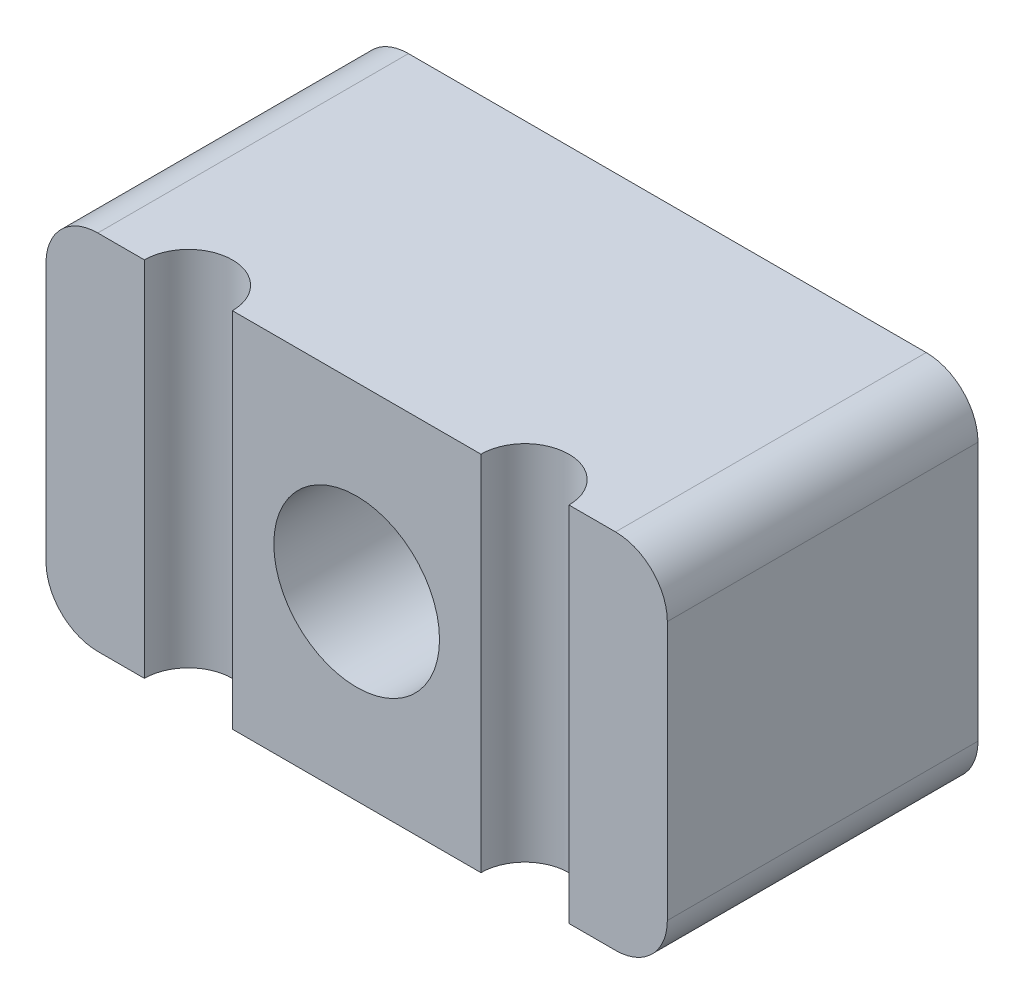
ISO-10303-21;
HEADER;
FILE_DESCRIPTION(('STEP AP214'),'2;1');
FILE_NAME('part.step','',(''),(''),'','','');
FILE_SCHEMA(('AUTOMOTIVE_DESIGN { 1 0 10303 214 1 1 1 1 }'));
ENDSEC;
DATA;
#1=APPLICATION_CONTEXT('core data for automotive mechanical design processes');
#2=APPLICATION_PROTOCOL_DEFINITION('international standard','automotive_design',2000,#1);
#3=PRODUCT_CONTEXT('',#1,'mechanical');
#4=PRODUCT('Part','Part','',(#3));
#5=PRODUCT_RELATED_PRODUCT_CATEGORY('part','',(#4));
#6=PRODUCT_DEFINITION_FORMATION('','',#4);
#7=PRODUCT_DEFINITION_CONTEXT('part definition',#1,'design');
#8=PRODUCT_DEFINITION('design','',#6,#7);
#9=PRODUCT_DEFINITION_SHAPE('','',#8);
#10=(LENGTH_UNIT() NAMED_UNIT(*) SI_UNIT(.MILLI.,.METRE.));
#11=(NAMED_UNIT(*) PLANE_ANGLE_UNIT() SI_UNIT($,.RADIAN.));
#12=(NAMED_UNIT(*) SI_UNIT($,.STERADIAN.) SOLID_ANGLE_UNIT());
#13=UNCERTAINTY_MEASURE_WITH_UNIT(LENGTH_MEASURE(1.E-05),#10,'distance_accuracy_value','');
#14=(GEOMETRIC_REPRESENTATION_CONTEXT(3) GLOBAL_UNCERTAINTY_ASSIGNED_CONTEXT((#13)) GLOBAL_UNIT_ASSIGNED_CONTEXT((#10,
#11,#12)) REPRESENTATION_CONTEXT('',''));
#15=CARTESIAN_POINT('',(0.,0.,0.));
#16=DIRECTION('',(0.,0.,1.));
#17=DIRECTION('',(1.,0.,0.));
#18=AXIS2_PLACEMENT_3D('',#15,#16,#17);
#19=CARTESIAN_POINT('',(1.,0.999999999999998,6.));
#20=DIRECTION('',(0.,0.,1.));
#21=DIRECTION('',(1.,0.,0.));
#22=AXIS2_PLACEMENT_3D('',#19,#20,#21);
#23=PLANE('',#22);
#24=DIRECTION('',(0.,-1.,0.));
#25=VECTOR('',#24,1.);
#26=CARTESIAN_POINT('',(8.40000000000004,8.90065778087486,6.00000000000001));
#27=LINE('',#26,#25);
#28=CARTESIAN_POINT('',(8.40000000000004,7.00000000000004,6.00000000000001));
#29=VERTEX_POINT('',#28);
#30=CARTESIAN_POINT('',(8.40000000000004,0.,6.00000000000001));
#31=VERTEX_POINT('',#30);
#32=EDGE_CURVE('E130',#29,#31,#27,.T.);
#33=ORIENTED_EDGE('',*,*,#32,.F.);
#34=DIRECTION('',(-1.,0.,0.));
#35=VECTOR('',#34,1.);
#36=CARTESIAN_POINT('',(11.,7.00000000000004,6.));
#37=LINE('',#36,#35);
#38=CARTESIAN_POINT('',(3.59999999999998,7.00000000000004,6.));
#39=VERTEX_POINT('',#38);
#40=EDGE_CURVE('E179',#29,#39,#37,.T.);
#41=ORIENTED_EDGE('',*,*,#40,.T.);
#42=DIRECTION('',(0.,-1.,0.));
#43=VECTOR('',#42,1.);
#44=CARTESIAN_POINT('',(3.59999999999998,8.90065778087486,5.99999999999999));
#45=LINE('',#44,#43);
#46=CARTESIAN_POINT('',(3.59999999999998,0.,5.99999999999999));
#47=VERTEX_POINT('',#46);
#48=EDGE_CURVE('E55',#39,#47,#45,.T.);
#49=ORIENTED_EDGE('',*,*,#48,.T.);
#50=DIRECTION('',(1.,0.,0.));
#51=VECTOR('',#50,1.);
#52=CARTESIAN_POINT('',(11.,0.,6.));
#53=LINE('',#52,#51);
#54=EDGE_CURVE('E151',#47,#31,#53,.T.);
#55=ORIENTED_EDGE('',*,*,#54,.T.);
#56=EDGE_LOOP('',(#33,#41,#49,#55));
#57=FACE_BOUND('',#56,.T.);
#58=CARTESIAN_POINT('',(6.,3.50000000000002,6.));
#59=DIRECTION('',(0.,0.,1.));
#60=DIRECTION('',(1.,0.,0.));
#61=AXIS2_PLACEMENT_3D('',#58,#59,#60);
#62=CIRCLE('',#61,1.6);
#63=CARTESIAN_POINT('',(7.6,3.50000000000002,6.));
#64=VERTEX_POINT('',#63);
#65=EDGE_CURVE('E191',#64,#64,#62,.T.);
#66=ORIENTED_EDGE('',*,*,#65,.F.);
#67=EDGE_LOOP('',(#66));
#68=FACE_BOUND('',#67,.T.);
#69=ADVANCED_FACE('F39',(#57,#68),#23,.T.);
#70=DIRECTION('',(0.,-1.,0.));
#71=VECTOR('',#70,1.);
#72=CARTESIAN_POINT('',(1.89999999999997,8.90065778087486,5.99999999999999));
#73=LINE('',#72,#71);
#74=CARTESIAN_POINT('',(1.89999999999997,7.00000000000004,5.99999999999999));
#75=VERTEX_POINT('',#74);
#76=CARTESIAN_POINT('',(1.89999999999997,0.,5.99999999999999));
#77=VERTEX_POINT('',#76);
#78=EDGE_CURVE('E268',#75,#77,#73,.T.);
#79=ORIENTED_EDGE('',*,*,#78,.F.);
#80=CARTESIAN_POINT('',(0.999999999999987,7.00000000000002,6.));
#81=VERTEX_POINT('',#80);
#82=EDGE_CURVE('E175',#75,#81,#37,.T.);
#83=ORIENTED_EDGE('',*,*,#82,.T.);
#84=CARTESIAN_POINT('',(0.999999999999984,6.,6.));
#85=DIRECTION('',(0.,0.,1.));
#86=DIRECTION('',(1.,0.,0.));
#87=AXIS2_PLACEMENT_3D('',#84,#85,#86);
#88=CIRCLE('',#87,1.00000000000002);
#89=CARTESIAN_POINT('',(0.,6.,6.));
#90=VERTEX_POINT('',#89);
#91=EDGE_CURVE('E178',#81,#90,#88,.T.);
#92=ORIENTED_EDGE('',*,*,#91,.T.);
#93=DIRECTION('',(0.,-1.,0.));
#94=VECTOR('',#93,1.);
#95=CARTESIAN_POINT('',(0.,6.,6.));
#96=LINE('',#95,#94);
#97=CARTESIAN_POINT('',(0.,1.,6.));
#98=VERTEX_POINT('',#97);
#99=EDGE_CURVE('E182',#90,#98,#96,.T.);
#100=ORIENTED_EDGE('',*,*,#99,.T.);
#101=CARTESIAN_POINT('',(1.,0.999999999999998,6.));
#102=DIRECTION('',(0.,0.,1.));
#103=DIRECTION('',(1.,0.,0.));
#104=AXIS2_PLACEMENT_3D('',#101,#102,#103);
#105=CIRCLE('',#104,0.999999999999993);
#106=CARTESIAN_POINT('',(1.,0.,6.));
#107=VERTEX_POINT('',#106);
#108=EDGE_CURVE('E152',#98,#107,#105,.T.);
#109=ORIENTED_EDGE('',*,*,#108,.T.);
#110=EDGE_CURVE('E154',#107,#77,#53,.T.);
#111=ORIENTED_EDGE('',*,*,#110,.T.);
#112=EDGE_LOOP('',(#79,#83,#92,#100,#109,#111));
#113=FACE_BOUND('',#112,.T.);
#114=ADVANCED_FACE('F284',(#113),#23,.T.);
#115=DIRECTION('',(0.,-1.,0.));
#116=VECTOR('',#115,1.);
#117=CARTESIAN_POINT('',(10.1,8.90065778087486,6.00000000000001));
#118=LINE('',#117,#116);
#119=CARTESIAN_POINT('',(10.1,7.00000000000004,6.));
#120=VERTEX_POINT('',#119);
#121=CARTESIAN_POINT('',(10.1,0.,6.00000000000001));
#122=VERTEX_POINT('',#121);
#123=EDGE_CURVE('E63',#120,#122,#118,.T.);
#124=ORIENTED_EDGE('',*,*,#123,.T.);
#125=CARTESIAN_POINT('',(11.,0.,6.));
#126=VERTEX_POINT('',#125);
#127=EDGE_CURVE('E141',#122,#126,#53,.T.);
#128=ORIENTED_EDGE('',*,*,#127,.T.);
#129=CARTESIAN_POINT('',(11.,1.00000000000003,6.));
#130=DIRECTION('',(0.,0.,1.));
#131=DIRECTION('',(-1.,0.,0.));
#132=AXIS2_PLACEMENT_3D('',#129,#130,#131);
#133=CIRCLE('',#132,0.999999999999991);
#134=CARTESIAN_POINT('',(12.,1.00000000000004,6.));
#135=VERTEX_POINT('',#134);
#136=EDGE_CURVE('E163',#126,#135,#133,.T.);
#137=ORIENTED_EDGE('',*,*,#136,.T.);
#138=DIRECTION('',(0.,1.,0.));
#139=VECTOR('',#138,1.);
#140=CARTESIAN_POINT('',(12.,6.00000000000003,6.));
#141=LINE('',#140,#139);
#142=CARTESIAN_POINT('',(12.,6.00000000000003,6.));
#143=VERTEX_POINT('',#142);
#144=EDGE_CURVE('E167',#135,#143,#141,.T.);
#145=ORIENTED_EDGE('',*,*,#144,.T.);
#146=CARTESIAN_POINT('',(11.,6.00000000000004,6.));
#147=DIRECTION('',(0.,0.,1.));
#148=DIRECTION('',(1.,0.,0.));
#149=AXIS2_PLACEMENT_3D('',#146,#147,#148);
#150=CIRCLE('',#149,1.);
#151=CARTESIAN_POINT('',(11.,7.00000000000004,6.));
#152=VERTEX_POINT('',#151);
#153=EDGE_CURVE('E170',#143,#152,#150,.T.);
#154=ORIENTED_EDGE('',*,*,#153,.T.);
#155=EDGE_CURVE('E144',#152,#120,#37,.T.);
#156=ORIENTED_EDGE('',*,*,#155,.T.);
#157=EDGE_LOOP('',(#124,#128,#137,#145,#154,#156));
#158=FACE_BOUND('',#157,.T.);
#159=ADVANCED_FACE('F140',(#158),#23,.T.);
#160=CARTESIAN_POINT('',(1.,0.999999999999998,0.));
#161=DIRECTION('',(0.,0.,1.));
#162=DIRECTION('',(1.,0.,0.));
#163=AXIS2_PLACEMENT_3D('',#160,#161,#162);
#164=PLANE('',#163);
#165=CARTESIAN_POINT('',(1.,0.999999999999998,0.));
#166=DIRECTION('',(0.,0.,1.));
#167=DIRECTION('',(1.,0.,0.));
#168=AXIS2_PLACEMENT_3D('',#165,#166,#167);
#169=CIRCLE('',#168,0.999999999999993);
#170=CARTESIAN_POINT('',(0.,1.,0.));
#171=VERTEX_POINT('',#170);
#172=CARTESIAN_POINT('',(1.,0.,0.));
#173=VERTEX_POINT('',#172);
#174=EDGE_CURVE('E186',#171,#173,#169,.T.);
#175=ORIENTED_EDGE('',*,*,#174,.F.);
#176=DIRECTION('',(0.,-1.,0.));
#177=VECTOR('',#176,1.);
#178=CARTESIAN_POINT('',(0.,6.,0.));
#179=LINE('',#178,#177);
#180=CARTESIAN_POINT('',(0.,6.,0.));
#181=VERTEX_POINT('',#180);
#182=EDGE_CURVE('E158',#181,#171,#179,.T.);
#183=ORIENTED_EDGE('',*,*,#182,.F.);
#184=CARTESIAN_POINT('',(0.999999999999984,6.,0.));
#185=DIRECTION('',(0.,0.,1.));
#186=DIRECTION('',(1.,0.,0.));
#187=AXIS2_PLACEMENT_3D('',#184,#185,#186);
#188=CIRCLE('',#187,1.00000000000002);
#189=CARTESIAN_POINT('',(0.999999999999987,7.00000000000002,0.));
#190=VERTEX_POINT('',#189);
#191=EDGE_CURVE('E206',#190,#181,#188,.T.);
#192=ORIENTED_EDGE('',*,*,#191,.F.);
#193=DIRECTION('',(-1.,0.,0.));
#194=VECTOR('',#193,1.);
#195=CARTESIAN_POINT('',(11.,7.00000000000004,0.));
#196=LINE('',#195,#194);
#197=CARTESIAN_POINT('',(11.,7.00000000000004,0.));
#198=VERTEX_POINT('',#197);
#199=EDGE_CURVE('E203',#198,#190,#196,.T.);
#200=ORIENTED_EDGE('',*,*,#199,.F.);
#201=CARTESIAN_POINT('',(11.,6.00000000000004,0.));
#202=DIRECTION('',(0.,0.,1.));
#203=DIRECTION('',(1.,0.,0.));
#204=AXIS2_PLACEMENT_3D('',#201,#202,#203);
#205=CIRCLE('',#204,1.);
#206=CARTESIAN_POINT('',(12.,6.00000000000003,0.));
#207=VERTEX_POINT('',#206);
#208=EDGE_CURVE('E200',#207,#198,#205,.T.);
#209=ORIENTED_EDGE('',*,*,#208,.F.);
#210=DIRECTION('',(0.,1.,0.));
#211=VECTOR('',#210,1.);
#212=CARTESIAN_POINT('',(12.,6.00000000000003,0.));
#213=LINE('',#212,#211);
#214=CARTESIAN_POINT('',(12.,1.00000000000004,0.));
#215=VERTEX_POINT('',#214);
#216=EDGE_CURVE('E197',#215,#207,#213,.T.);
#217=ORIENTED_EDGE('',*,*,#216,.F.);
#218=CARTESIAN_POINT('',(11.,1.00000000000003,0.));
#219=DIRECTION('',(0.,0.,1.));
#220=DIRECTION('',(-1.,0.,0.));
#221=AXIS2_PLACEMENT_3D('',#218,#219,#220);
#222=CIRCLE('',#221,0.999999999999991);
#223=CARTESIAN_POINT('',(11.,0.,0.));
#224=VERTEX_POINT('',#223);
#225=EDGE_CURVE('E194',#224,#215,#222,.T.);
#226=ORIENTED_EDGE('',*,*,#225,.F.);
#227=DIRECTION('',(1.,0.,0.));
#228=VECTOR('',#227,1.);
#229=CARTESIAN_POINT('',(11.,0.,0.));
#230=LINE('',#229,#228);
#231=EDGE_CURVE('E190',#173,#224,#230,.T.);
#232=ORIENTED_EDGE('',*,*,#231,.F.);
#233=EDGE_LOOP('',(#175,#183,#192,#200,#209,#217,#226,#232));
#234=FACE_BOUND('',#233,.T.);
#235=CARTESIAN_POINT('',(6.,3.50000000000002,0.));
#236=DIRECTION('',(0.,0.,1.));
#237=DIRECTION('',(1.,0.,0.));
#238=AXIS2_PLACEMENT_3D('',#235,#236,#237);
#239=CIRCLE('',#238,1.6);
#240=CARTESIAN_POINT('',(7.6,3.50000000000002,0.));
#241=VERTEX_POINT('',#240);
#242=EDGE_CURVE('E258',#241,#241,#239,.T.);
#243=ORIENTED_EDGE('',*,*,#242,.T.);
#244=EDGE_LOOP('',(#243));
#245=FACE_BOUND('',#244,.T.);
#246=ADVANCED_FACE('F240',(#234,#245),#164,.F.);
#247=CARTESIAN_POINT('',(1.,0.999999999999998,6.));
#248=DIRECTION('',(0.,0.,-1.));
#249=DIRECTION('',(-1.,0.,0.));
#250=AXIS2_PLACEMENT_3D('',#247,#248,#249);
#251=CYLINDRICAL_SURFACE('',#250,0.999999999999993);
#252=ORIENTED_EDGE('',*,*,#174,.T.);
#253=DIRECTION('',(0.,0.,-1.));
#254=VECTOR('',#253,1.);
#255=CARTESIAN_POINT('',(1.,0.,6.));
#256=LINE('',#255,#254);
#257=EDGE_CURVE('E11',#107,#173,#256,.T.);
#258=ORIENTED_EDGE('',*,*,#257,.F.);
#259=ORIENTED_EDGE('',*,*,#108,.F.);
#260=DIRECTION('',(0.,0.,-1.));
#261=VECTOR('',#260,1.);
#262=CARTESIAN_POINT('',(0.,1.,6.));
#263=LINE('',#262,#261);
#264=EDGE_CURVE('E185',#98,#171,#263,.T.);
#265=ORIENTED_EDGE('',*,*,#264,.T.);
#266=EDGE_LOOP('',(#252,#258,#259,#265));
#267=FACE_BOUND('',#266,.T.);
#268=ADVANCED_FACE('F41',(#267),#251,.T.);
#269=CARTESIAN_POINT('',(11.,0.,6.));
#270=DIRECTION('',(0.,1.,0.));
#271=DIRECTION('',(0.,0.,1.));
#272=AXIS2_PLACEMENT_3D('',#269,#270,#271);
#273=PLANE('',#272);
#274=ORIENTED_EDGE('',*,*,#127,.F.);
#275=CARTESIAN_POINT('',(9.25000000000004,0.,6.00000000000001));
#276=DIRECTION('',(0.,-1.,0.));
#277=DIRECTION('',(0.,0.,-1.));
#278=AXIS2_PLACEMENT_3D('',#275,#276,#277);
#279=CIRCLE('',#278,0.85);
#280=EDGE_CURVE('E127',#31,#122,#279,.T.);
#281=ORIENTED_EDGE('',*,*,#280,.F.);
#282=ORIENTED_EDGE('',*,*,#54,.F.);
#283=CARTESIAN_POINT('',(2.74999999999998,0.,6.00000000000001));
#284=DIRECTION('',(0.,-1.,0.));
#285=DIRECTION('',(0.,0.,-1.));
#286=AXIS2_PLACEMENT_3D('',#283,#284,#285);
#287=CIRCLE('',#286,0.850000000000004);
#288=EDGE_CURVE('E269',#77,#47,#287,.T.);
#289=ORIENTED_EDGE('',*,*,#288,.F.);
#290=ORIENTED_EDGE('',*,*,#110,.F.);
#291=ORIENTED_EDGE('',*,*,#257,.T.);
#292=ORIENTED_EDGE('',*,*,#231,.T.);
#293=DIRECTION('',(0.,0.,-1.));
#294=VECTOR('',#293,1.);
#295=CARTESIAN_POINT('',(11.,0.,6.));
#296=LINE('',#295,#294);
#297=EDGE_CURVE('E48',#126,#224,#296,.T.);
#298=ORIENTED_EDGE('',*,*,#297,.F.);
#299=EDGE_LOOP('',(#274,#281,#282,#289,#290,#291,#292,#298));
#300=FACE_BOUND('',#299,.T.);
#301=ADVANCED_FACE('F147',(#300),#273,.F.);
#302=CARTESIAN_POINT('',(11.,1.00000000000003,6.));
#303=DIRECTION('',(0.,0.,-1.));
#304=DIRECTION('',(-1.,0.,0.));
#305=AXIS2_PLACEMENT_3D('',#302,#303,#304);
#306=CYLINDRICAL_SURFACE('',#305,0.999999999999991);
#307=ORIENTED_EDGE('',*,*,#225,.T.);
#308=DIRECTION('',(0.,0.,-1.));
#309=VECTOR('',#308,1.);
#310=CARTESIAN_POINT('',(12.,1.00000000000004,6.));
#311=LINE('',#310,#309);
#312=EDGE_CURVE('E230',#135,#215,#311,.T.);
#313=ORIENTED_EDGE('',*,*,#312,.F.);
#314=ORIENTED_EDGE('',*,*,#136,.F.);
#315=ORIENTED_EDGE('',*,*,#297,.T.);
#316=EDGE_LOOP('',(#307,#313,#314,#315));
#317=FACE_BOUND('',#316,.T.);
#318=ADVANCED_FACE('F236',(#317),#306,.T.);
#319=CARTESIAN_POINT('',(12.,6.00000000000003,6.));
#320=DIRECTION('',(-1.,0.,0.));
#321=DIRECTION('',(0.,0.,1.));
#322=AXIS2_PLACEMENT_3D('',#319,#320,#321);
#323=PLANE('',#322);
#324=ORIENTED_EDGE('',*,*,#216,.T.);
#325=DIRECTION('',(0.,0.,-1.));
#326=VECTOR('',#325,1.);
#327=CARTESIAN_POINT('',(12.,6.00000000000003,6.));
#328=LINE('',#327,#326);
#329=EDGE_CURVE('E226',#143,#207,#328,.T.);
#330=ORIENTED_EDGE('',*,*,#329,.F.);
#331=ORIENTED_EDGE('',*,*,#144,.F.);
#332=ORIENTED_EDGE('',*,*,#312,.T.);
#333=EDGE_LOOP('',(#324,#330,#331,#332));
#334=FACE_BOUND('',#333,.T.);
#335=ADVANCED_FACE('F246',(#334),#323,.F.);
#336=CARTESIAN_POINT('',(11.,6.00000000000004,6.));
#337=DIRECTION('',(0.,0.,-1.));
#338=DIRECTION('',(-1.,0.,0.));
#339=AXIS2_PLACEMENT_3D('',#336,#337,#338);
#340=CYLINDRICAL_SURFACE('',#339,1.);
#341=ORIENTED_EDGE('',*,*,#208,.T.);
#342=DIRECTION('',(0.,0.,-1.));
#343=VECTOR('',#342,1.);
#344=CARTESIAN_POINT('',(11.,7.00000000000004,6.));
#345=LINE('',#344,#343);
#346=EDGE_CURVE('E222',#152,#198,#345,.T.);
#347=ORIENTED_EDGE('',*,*,#346,.F.);
#348=ORIENTED_EDGE('',*,*,#153,.F.);
#349=ORIENTED_EDGE('',*,*,#329,.T.);
#350=EDGE_LOOP('',(#341,#347,#348,#349));
#351=FACE_BOUND('',#350,.T.);
#352=ADVANCED_FACE('F250',(#351),#340,.T.);
#353=CARTESIAN_POINT('',(11.,7.00000000000004,6.));
#354=DIRECTION('',(0.,-1.,0.));
#355=DIRECTION('',(0.,0.,-1.));
#356=AXIS2_PLACEMENT_3D('',#353,#354,#355);
#357=PLANE('',#356);
#358=ORIENTED_EDGE('',*,*,#40,.F.);
#359=CARTESIAN_POINT('',(9.25000000000004,7.00000000000004,6.00000000000001));
#360=DIRECTION('',(0.,-1.,0.));
#361=DIRECTION('',(0.,0.,-1.));
#362=AXIS2_PLACEMENT_3D('',#359,#360,#361);
#363=CIRCLE('',#362,0.85);
#364=EDGE_CURVE('E255',#120,#29,#363,.F.);
#365=ORIENTED_EDGE('',*,*,#364,.F.);
#366=ORIENTED_EDGE('',*,*,#155,.F.);
#367=ORIENTED_EDGE('',*,*,#346,.T.);
#368=ORIENTED_EDGE('',*,*,#199,.T.);
#369=DIRECTION('',(0.,0.,-1.));
#370=VECTOR('',#369,1.);
#371=CARTESIAN_POINT('',(0.999999999999987,7.00000000000002,6.));
#372=LINE('',#371,#370);
#373=EDGE_CURVE('E218',#81,#190,#372,.T.);
#374=ORIENTED_EDGE('',*,*,#373,.F.);
#375=ORIENTED_EDGE('',*,*,#82,.F.);
#376=CARTESIAN_POINT('',(2.74999999999998,7.00000000000004,6.00000000000001));
#377=DIRECTION('',(0.,-1.,0.));
#378=DIRECTION('',(0.,0.,-1.));
#379=AXIS2_PLACEMENT_3D('',#376,#377,#378);
#380=CIRCLE('',#379,0.850000000000004);
#381=EDGE_CURVE('E136',#39,#75,#380,.F.);
#382=ORIENTED_EDGE('',*,*,#381,.F.);
#383=EDGE_LOOP('',(#358,#365,#366,#367,#368,#374,#375,#382));
#384=FACE_BOUND('',#383,.T.);
#385=ADVANCED_FACE('F254',(#384),#357,.F.);
#386=CARTESIAN_POINT('',(0.999999999999984,6.,6.));
#387=DIRECTION('',(0.,0.,-1.));
#388=DIRECTION('',(-1.,0.,0.));
#389=AXIS2_PLACEMENT_3D('',#386,#387,#388);
#390=CYLINDRICAL_SURFACE('',#389,1.00000000000002);
#391=ORIENTED_EDGE('',*,*,#191,.T.);
#392=DIRECTION('',(0.,0.,-1.));
#393=VECTOR('',#392,1.);
#394=CARTESIAN_POINT('',(0.,6.,6.));
#395=LINE('',#394,#393);
#396=EDGE_CURVE('E214',#90,#181,#395,.T.);
#397=ORIENTED_EDGE('',*,*,#396,.F.);
#398=ORIENTED_EDGE('',*,*,#91,.F.);
#399=ORIENTED_EDGE('',*,*,#373,.T.);
#400=EDGE_LOOP('',(#391,#397,#398,#399));
#401=FACE_BOUND('',#400,.T.);
#402=ADVANCED_FACE('F304',(#401),#390,.T.);
#403=CARTESIAN_POINT('',(0.,6.,6.));
#404=DIRECTION('',(1.,0.,0.));
#405=DIRECTION('',(0.,0.,-1.));
#406=AXIS2_PLACEMENT_3D('',#403,#404,#405);
#407=PLANE('',#406);
#408=ORIENTED_EDGE('',*,*,#182,.T.);
#409=ORIENTED_EDGE('',*,*,#264,.F.);
#410=ORIENTED_EDGE('',*,*,#99,.F.);
#411=ORIENTED_EDGE('',*,*,#396,.T.);
#412=EDGE_LOOP('',(#408,#409,#410,#411));
#413=FACE_BOUND('',#412,.T.);
#414=ADVANCED_FACE('F301',(#413),#407,.F.);
#415=CARTESIAN_POINT('',(6.,3.50000000000002,6.));
#416=DIRECTION('',(0.,0.,-1.));
#417=DIRECTION('',(-1.,0.,0.));
#418=AXIS2_PLACEMENT_3D('',#415,#416,#417);
#419=CYLINDRICAL_SURFACE('',#418,1.6);
#420=ORIENTED_EDGE('',*,*,#65,.T.);
#421=EDGE_LOOP('',(#420));
#422=FACE_BOUND('',#421,.T.);
#423=ORIENTED_EDGE('',*,*,#242,.F.);
#424=EDGE_LOOP('',(#423));
#425=FACE_BOUND('',#424,.T.);
#426=ADVANCED_FACE('F280',(#422,#425),#419,.F.);
#427=CARTESIAN_POINT('',(2.74999999999998,8.90065778087486,6.00000000000001));
#428=DIRECTION('',(0.,-1.,0.));
#429=DIRECTION('',(0.,0.,-1.));
#430=AXIS2_PLACEMENT_3D('',#427,#428,#429);
#431=CYLINDRICAL_SURFACE('',#430,0.850000000000004);
#432=ORIENTED_EDGE('',*,*,#381,.T.);
#433=ORIENTED_EDGE('',*,*,#78,.T.);
#434=ORIENTED_EDGE('',*,*,#288,.T.);
#435=ORIENTED_EDGE('',*,*,#48,.F.);
#436=EDGE_LOOP('',(#432,#433,#434,#435));
#437=FACE_BOUND('',#436,.T.);
#438=ADVANCED_FACE('F352',(#437),#431,.F.);
#439=CARTESIAN_POINT('',(9.25000000000004,8.90065778087486,6.00000000000001));
#440=DIRECTION('',(0.,-1.,0.));
#441=DIRECTION('',(0.,0.,-1.));
#442=AXIS2_PLACEMENT_3D('',#439,#440,#441);
#443=CYLINDRICAL_SURFACE('',#442,0.85);
#444=ORIENTED_EDGE('',*,*,#364,.T.);
#445=ORIENTED_EDGE('',*,*,#32,.T.);
#446=ORIENTED_EDGE('',*,*,#280,.T.);
#447=ORIENTED_EDGE('',*,*,#123,.F.);
#448=EDGE_LOOP('',(#444,#445,#446,#447));
#449=FACE_BOUND('',#448,.T.);
#450=ADVANCED_FACE('F128',(#449),#443,.F.);
#451=CLOSED_SHELL('',(#69,#114,#159,#246,#268,#301,#318,#335,#352,#385,#402,#414,#426,#438,#450));
#452=MANIFOLD_SOLID_BREP('B2',#451);
#453=ADVANCED_BREP_SHAPE_REPRESENTATION('',(#18,#452),#14);
#454=SHAPE_DEFINITION_REPRESENTATION(#9,#453);
ENDSEC;
END-ISO-10303-21;
